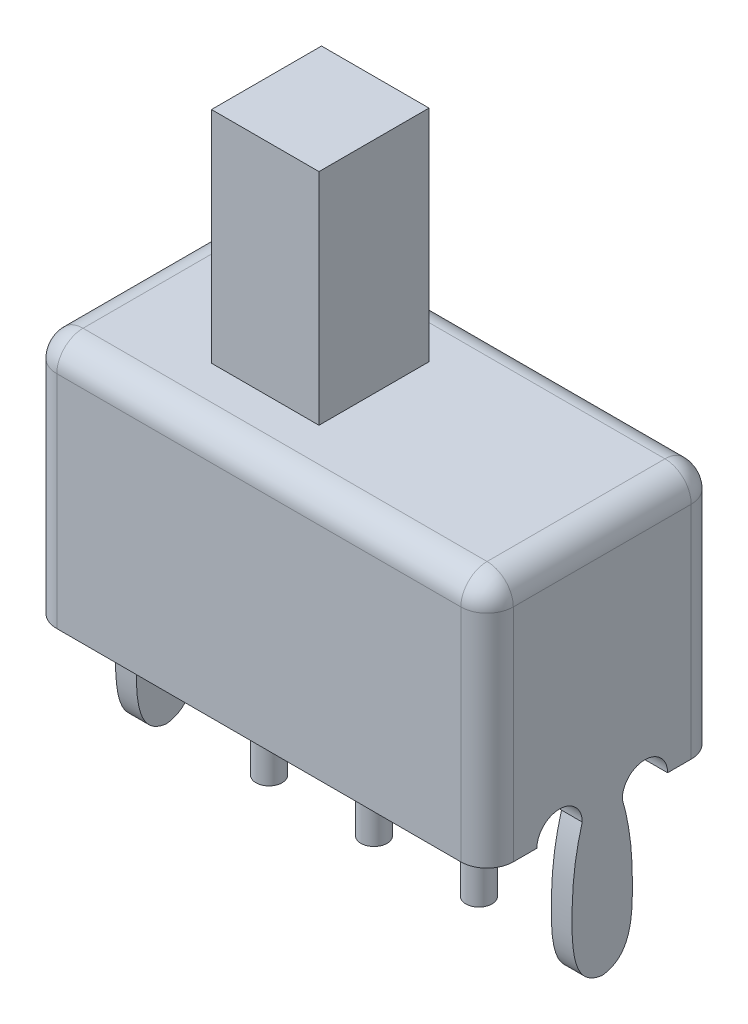
ISO-10303-21;
HEADER;
FILE_DESCRIPTION(('STEP AP214'),'2;1');
FILE_NAME('part.step','',(''),(''),'','','');
FILE_SCHEMA(('AUTOMOTIVE_DESIGN { 1 0 10303 214 1 1 1 1 }'));
ENDSEC;
DATA;
#1=APPLICATION_CONTEXT('core data for automotive mechanical design processes');
#2=APPLICATION_PROTOCOL_DEFINITION('international standard','automotive_design',2000,#1);
#3=PRODUCT_CONTEXT('',#1,'mechanical');
#4=PRODUCT('Part','Part','',(#3));
#5=PRODUCT_RELATED_PRODUCT_CATEGORY('part','',(#4));
#6=PRODUCT_DEFINITION_FORMATION('','',#4);
#7=PRODUCT_DEFINITION_CONTEXT('part definition',#1,'design');
#8=PRODUCT_DEFINITION('design','',#6,#7);
#9=PRODUCT_DEFINITION_SHAPE('','',#8);
#10=(LENGTH_UNIT() NAMED_UNIT(*) SI_UNIT(.MILLI.,.METRE.));
#11=(NAMED_UNIT(*) PLANE_ANGLE_UNIT() SI_UNIT($,.RADIAN.));
#12=(NAMED_UNIT(*) SI_UNIT($,.STERADIAN.) SOLID_ANGLE_UNIT());
#13=UNCERTAINTY_MEASURE_WITH_UNIT(LENGTH_MEASURE(1.E-05),#10,'distance_accuracy_value','');
#14=(GEOMETRIC_REPRESENTATION_CONTEXT(3) GLOBAL_UNCERTAINTY_ASSIGNED_CONTEXT((#13)) GLOBAL_UNIT_ASSIGNED_CONTEXT((#10,
#11,#12)) REPRESENTATION_CONTEXT('',''));
#15=CARTESIAN_POINT('',(0.,0.,0.));
#16=DIRECTION('',(0.,0.,1.));
#17=DIRECTION('',(1.,0.,0.));
#18=AXIS2_PLACEMENT_3D('',#15,#16,#17);
#19=CARTESIAN_POINT('',(4.35,0.,0.381552716050685));
#20=CARTESIAN_POINT('',(4.35,-0.533550096427688,0.533291166974432));
#21=CARTESIAN_POINT('',(4.35,-1.40898428752531,0.619043070075609));
#22=CARTESIAN_POINT('',(4.35,-2.66047603641151,0.532774779958889));
#23=CARTESIAN_POINT('',(4.35,-2.72110857254831,0.));
#24=B_SPLINE_CURVE_WITH_KNOTS('',3,(#19,#20,#21,#22,#23),.UNSPECIFIED.,.F.,.F.,(4,1,4),(0.,
0.537169863718455,1.),.UNSPECIFIED.);
#25=DIRECTION('',(-1.,0.,0.));
#26=VECTOR('',#25,1.);
#27=SURFACE_OF_LINEAR_EXTRUSION('',#24,#26);
#28=CARTESIAN_POINT('',(-3.95490021722665,0.,0.381552716050685));
#29=CARTESIAN_POINT('',(-3.95490021722665,-0.533550096427688,0.533291166974432));
#30=CARTESIAN_POINT('',(-3.95490021722665,-1.40898428752531,0.619043070075609));
#31=CARTESIAN_POINT('',(-3.95490021722665,-2.66047603641151,0.532774779958889));
#32=CARTESIAN_POINT('',(-3.95490021722665,-2.72110857254831,0.));
#33=B_SPLINE_CURVE_WITH_KNOTS('',3,(#28,#29,#30,#31,#32),.UNSPECIFIED.,.F.,.F.,(4,1,4),(0.,
0.537169863718455,1.),.UNSPECIFIED.);
#34=CARTESIAN_POINT('',(-3.95490021722665,0.,0.381552716050685));
#35=VERTEX_POINT('',#34);
#36=CARTESIAN_POINT('',(-3.95490021722665,-2.72110857254831,0.));
#37=VERTEX_POINT('',#36);
#38=EDGE_CURVE('E362',#35,#37,#33,.T.);
#39=ORIENTED_EDGE('',*,*,#38,.F.);
#40=DIRECTION('',(-1.,0.,0.));
#41=VECTOR('',#40,1.);
#42=CARTESIAN_POINT('',(4.35,0.,0.381552716050685));
#43=LINE('',#42,#41);
#44=CARTESIAN_POINT('',(-4.35,0.,0.381552716050685));
#45=VERTEX_POINT('',#44);
#46=EDGE_CURVE('E245',#35,#45,#43,.T.);
#47=ORIENTED_EDGE('',*,*,#46,.T.);
#48=CARTESIAN_POINT('',(-4.35,0.,0.381552716050685));
#49=CARTESIAN_POINT('',(-4.35,-0.533550096427688,0.533291166974432));
#50=CARTESIAN_POINT('',(-4.35,-1.40898428752531,0.619043070075609));
#51=CARTESIAN_POINT('',(-4.35,-2.66047603641151,0.532774779958889));
#52=CARTESIAN_POINT('',(-4.35,-2.72110857254831,0.));
#53=B_SPLINE_CURVE_WITH_KNOTS('',3,(#48,#49,#50,#51,#52),.UNSPECIFIED.,.F.,.F.,(4,1,4),(0.,
0.537169863718455,1.),.UNSPECIFIED.);
#54=CARTESIAN_POINT('',(-4.35,-2.72110857254831,0.));
#55=VERTEX_POINT('',#54);
#56=EDGE_CURVE('E480',#45,#55,#53,.T.);
#57=ORIENTED_EDGE('',*,*,#56,.T.);
#58=DIRECTION('',(-1.,0.,0.));
#59=VECTOR('',#58,1.);
#60=CARTESIAN_POINT('',(4.35,-2.72110857254831,0.));
#61=LINE('',#60,#59);
#62=EDGE_CURVE('E241',#37,#55,#61,.T.);
#63=ORIENTED_EDGE('',*,*,#62,.F.);
#64=EDGE_LOOP('',(#39,#47,#57,#63));
#65=FACE_BOUND('',#64,.T.);
#66=ADVANCED_FACE('F37',(#65),#27,.F.);
#67=CARTESIAN_POINT('',(3.95490021722665,0.,0.381552716050685));
#68=CARTESIAN_POINT('',(3.95490021722665,-0.533550096427688,0.533291166974432));
#69=CARTESIAN_POINT('',(3.95490021722665,-1.40898428752531,0.619043070075609));
#70=CARTESIAN_POINT('',(3.95490021722665,-2.66047603641151,0.532774779958889));
#71=CARTESIAN_POINT('',(3.95490021722665,-2.72110857254831,0.));
#72=B_SPLINE_CURVE_WITH_KNOTS('',3,(#67,#68,#69,#70,#71),.UNSPECIFIED.,.F.,.F.,(4,1,4),(0.,
0.537169863718455,1.),.UNSPECIFIED.);
#73=CARTESIAN_POINT('',(3.95490021722665,-2.72110857254831,0.));
#74=VERTEX_POINT('',#73);
#75=CARTESIAN_POINT('',(3.95490021722665,0.,0.381552716050685));
#76=VERTEX_POINT('',#75);
#77=EDGE_CURVE('E347',#74,#76,#72,.F.);
#78=ORIENTED_EDGE('',*,*,#77,.F.);
#79=CARTESIAN_POINT('',(4.35,-2.72110857254831,0.));
#80=VERTEX_POINT('',#79);
#81=EDGE_CURVE('E242',#80,#74,#61,.T.);
#82=ORIENTED_EDGE('',*,*,#81,.F.);
#83=CARTESIAN_POINT('',(4.35,0.,0.381552716050685));
#84=VERTEX_POINT('',#83);
#85=EDGE_CURVE('E378',#84,#80,#24,.T.);
#86=ORIENTED_EDGE('',*,*,#85,.F.);
#87=EDGE_CURVE('E246',#84,#76,#43,.T.);
#88=ORIENTED_EDGE('',*,*,#87,.T.);
#89=EDGE_LOOP('',(#78,#82,#86,#88));
#90=FACE_BOUND('',#89,.T.);
#91=ADVANCED_FACE('F395',(#90),#27,.F.);
#92=CARTESIAN_POINT('',(4.35,-2.72110857254831,0.));
#93=CARTESIAN_POINT('',(4.35,-2.66047603641151,-0.532774779958891));
#94=CARTESIAN_POINT('',(4.35,-1.40898428752531,-0.619043070075611));
#95=CARTESIAN_POINT('',(4.35,-0.533550096427688,-0.533291166974434));
#96=CARTESIAN_POINT('',(4.35,0.,-0.381552716050687));
#97=B_SPLINE_CURVE_WITH_KNOTS('',3,(#92,#93,#94,#95,#96),.UNSPECIFIED.,.F.,.F.,(4,1,4),(0.,
0.462830136281545,1.),.UNSPECIFIED.);
#98=DIRECTION('',(-1.,0.,0.));
#99=VECTOR('',#98,1.);
#100=SURFACE_OF_LINEAR_EXTRUSION('',#97,#99);
#101=CARTESIAN_POINT('',(-3.95490021722665,-2.72110857254831,0.));
#102=CARTESIAN_POINT('',(-3.95490021722665,-2.66047603641151,-0.532774779958891));
#103=CARTESIAN_POINT('',(-3.95490021722665,-1.40898428752531,-0.619043070075611));
#104=CARTESIAN_POINT('',(-3.95490021722665,-0.533550096427688,-0.533291166974434));
#105=CARTESIAN_POINT('',(-3.95490021722665,0.,-0.381552716050687));
#106=B_SPLINE_CURVE_WITH_KNOTS('',3,(#101,#102,#103,#104,#105),.UNSPECIFIED.,.F.,.F.,(4,1,4),
(0.,0.462830136281545,1.),.UNSPECIFIED.);
#107=CARTESIAN_POINT('',(-3.95490021722665,0.,-0.381552716050685));
#108=VERTEX_POINT('',#107);
#109=EDGE_CURVE('E354',#37,#108,#106,.T.);
#110=ORIENTED_EDGE('',*,*,#109,.F.);
#111=ORIENTED_EDGE('',*,*,#62,.T.);
#112=CARTESIAN_POINT('',(-4.35,-2.72110857254831,0.));
#113=CARTESIAN_POINT('',(-4.35,-2.66047603641151,-0.532774779958891));
#114=CARTESIAN_POINT('',(-4.35,-1.40898428752531,-0.619043070075611));
#115=CARTESIAN_POINT('',(-4.35,-0.533550096427688,-0.533291166974434));
#116=CARTESIAN_POINT('',(-4.35,0.,-0.381552716050687));
#117=B_SPLINE_CURVE_WITH_KNOTS('',3,(#112,#113,#114,#115,#116),.UNSPECIFIED.,.F.,.F.,(4,1,4),
(0.,0.462830136281545,1.),.UNSPECIFIED.);
#118=CARTESIAN_POINT('',(-4.35,0.,-0.381552716050685));
#119=VERTEX_POINT('',#118);
#120=EDGE_CURVE('E475',#55,#119,#117,.T.);
#121=ORIENTED_EDGE('',*,*,#120,.T.);
#122=DIRECTION('',(-1.,0.,0.));
#123=VECTOR('',#122,1.);
#124=CARTESIAN_POINT('',(4.35,0.,-0.381552716050685));
#125=LINE('',#124,#123);
#126=EDGE_CURVE('E237',#108,#119,#125,.T.);
#127=ORIENTED_EDGE('',*,*,#126,.F.);
#128=EDGE_LOOP('',(#110,#111,#121,#127));
#129=FACE_BOUND('',#128,.T.);
#130=ADVANCED_FACE('F397',(#129),#100,.F.);
#131=CARTESIAN_POINT('',(3.95490021722665,-2.72110857254831,0.));
#132=CARTESIAN_POINT('',(3.95490021722665,-2.66047603641151,-0.532774779958891));
#133=CARTESIAN_POINT('',(3.95490021722665,-1.40898428752531,-0.619043070075611));
#134=CARTESIAN_POINT('',(3.95490021722665,-0.533550096427688,-0.533291166974434));
#135=CARTESIAN_POINT('',(3.95490021722665,0.,-0.381552716050687));
#136=B_SPLINE_CURVE_WITH_KNOTS('',3,(#131,#132,#133,#134,#135),.UNSPECIFIED.,.F.,.F.,(4,1,4),
(0.,0.462830136281545,1.),.UNSPECIFIED.);
#137=CARTESIAN_POINT('',(3.95490021722665,0.,-0.381552716050685));
#138=VERTEX_POINT('',#137);
#139=EDGE_CURVE('E343',#138,#74,#136,.F.);
#140=ORIENTED_EDGE('',*,*,#139,.F.);
#141=CARTESIAN_POINT('',(4.35,0.,-0.381552716050685));
#142=VERTEX_POINT('',#141);
#143=EDGE_CURVE('E238',#142,#138,#125,.T.);
#144=ORIENTED_EDGE('',*,*,#143,.F.);
#145=EDGE_CURVE('E383',#80,#142,#97,.T.);
#146=ORIENTED_EDGE('',*,*,#145,.F.);
#147=ORIENTED_EDGE('',*,*,#81,.T.);
#148=EDGE_LOOP('',(#140,#144,#146,#147));
#149=FACE_BOUND('',#148,.T.);
#150=ADVANCED_FACE('F506',(#149),#100,.F.);
#151=CARTESIAN_POINT('',(4.35,4.70753413408899,-1.0484251024618));
#152=DIRECTION('',(0.,0.,1.));
#153=DIRECTION('',(1.,0.,0.));
#154=AXIS2_PLACEMENT_3D('',#151,#152,#153);
#155=PLANE('',#154);
#156=DIRECTION('',(0.,-1.,0.));
#157=VECTOR('',#156,1.);
#158=CARTESIAN_POINT('',(-2.04866945764033,4.70753413408899,-1.0484251024618));
#159=LINE('',#158,#157);
#160=CARTESIAN_POINT('',(-2.04866945764033,8.89467131542077,-1.0484251024618));
#161=VERTEX_POINT('',#160);
#162=CARTESIAN_POINT('',(-2.04866945764033,4.70753413408899,-1.0484251024618));
#163=VERTEX_POINT('',#162);
#164=EDGE_CURVE('E200',#161,#163,#159,.T.);
#165=ORIENTED_EDGE('',*,*,#164,.F.);
#166=DIRECTION('',(-1.,0.,0.));
#167=VECTOR('',#166,1.);
#168=CARTESIAN_POINT('',(4.35,8.89467131542077,-1.0484251024618));
#169=LINE('',#168,#167);
#170=CARTESIAN_POINT('',(0.,8.89467131542077,-1.0484251024618));
#171=VERTEX_POINT('',#170);
#172=EDGE_CURVE('E210',#171,#161,#169,.T.);
#173=ORIENTED_EDGE('',*,*,#172,.F.);
#174=DIRECTION('',(0.,1.,0.));
#175=VECTOR('',#174,1.);
#176=CARTESIAN_POINT('',(0.,4.70753413408899,-1.0484251024618));
#177=LINE('',#176,#175);
#178=CARTESIAN_POINT('',(0.,4.70753413408899,-1.0484251024618));
#179=VERTEX_POINT('',#178);
#180=EDGE_CURVE('E201',#179,#171,#177,.T.);
#181=ORIENTED_EDGE('',*,*,#180,.F.);
#182=DIRECTION('',(-1.,0.,0.));
#183=VECTOR('',#182,1.);
#184=CARTESIAN_POINT('',(4.35,4.70753413408899,-1.0484251024618));
#185=LINE('',#184,#183);
#186=EDGE_CURVE('E218',#179,#163,#185,.T.);
#187=ORIENTED_EDGE('',*,*,#186,.T.);
#188=EDGE_LOOP('',(#165,#173,#181,#187));
#189=FACE_BOUND('',#188,.T.);
#190=ADVANCED_FACE('F597',(#189),#155,.F.);
#191=CARTESIAN_POINT('',(4.35,8.89467131542077,1.0484251024618));
#192=DIRECTION('',(0.,-1.,0.));
#193=DIRECTION('',(0.,0.,-1.));
#194=AXIS2_PLACEMENT_3D('',#191,#192,#193);
#195=PLANE('',#194);
#196=DIRECTION('',(0.,0.,-1.));
#197=VECTOR('',#196,1.);
#198=CARTESIAN_POINT('',(-2.04866945764033,8.89467131542077,2.19506792805727));
#199=LINE('',#198,#197);
#200=CARTESIAN_POINT('',(-2.04866945764033,8.89467131542077,1.0484251024618));
#201=VERTEX_POINT('',#200);
#202=EDGE_CURVE('E193',#201,#161,#199,.T.);
#203=ORIENTED_EDGE('',*,*,#202,.F.);
#204=DIRECTION('',(-1.,0.,0.));
#205=VECTOR('',#204,1.);
#206=CARTESIAN_POINT('',(4.35,8.89467131542077,1.0484251024618));
#207=LINE('',#206,#205);
#208=CARTESIAN_POINT('',(0.,8.89467131542077,1.0484251024618));
#209=VERTEX_POINT('',#208);
#210=EDGE_CURVE('E208',#209,#201,#207,.T.);
#211=ORIENTED_EDGE('',*,*,#210,.F.);
#212=DIRECTION('',(0.,0.,-1.));
#213=VECTOR('',#212,1.);
#214=CARTESIAN_POINT('',(0.,8.89467131542077,2.19506792805727));
#215=LINE('',#214,#213);
#216=EDGE_CURVE('E211',#209,#171,#215,.T.);
#217=ORIENTED_EDGE('',*,*,#216,.T.);
#218=ORIENTED_EDGE('',*,*,#172,.T.);
#219=EDGE_LOOP('',(#203,#211,#217,#218));
#220=FACE_BOUND('',#219,.T.);
#221=ADVANCED_FACE('F206',(#220),#195,.F.);
#222=CARTESIAN_POINT('',(4.35,4.70753413408899,1.0484251024618));
#223=DIRECTION('',(0.,0.,-1.));
#224=DIRECTION('',(-1.,0.,0.));
#225=AXIS2_PLACEMENT_3D('',#222,#223,#224);
#226=PLANE('',#225);
#227=DIRECTION('',(0.,1.,0.));
#228=VECTOR('',#227,1.);
#229=CARTESIAN_POINT('',(-2.04866945764033,4.70753413408899,1.0484251024618));
#230=LINE('',#229,#228);
#231=CARTESIAN_POINT('',(-2.04866945764033,4.70753413408899,1.0484251024618));
#232=VERTEX_POINT('',#231);
#233=EDGE_CURVE('E189',#232,#201,#230,.T.);
#234=ORIENTED_EDGE('',*,*,#233,.F.);
#235=DIRECTION('',(-1.,0.,0.));
#236=VECTOR('',#235,1.);
#237=CARTESIAN_POINT('',(4.35,4.70753413408899,1.0484251024618));
#238=LINE('',#237,#236);
#239=CARTESIAN_POINT('',(0.,4.70753413408899,1.0484251024618));
#240=VERTEX_POINT('',#239);
#241=EDGE_CURVE('E216',#240,#232,#238,.T.);
#242=ORIENTED_EDGE('',*,*,#241,.F.);
#243=DIRECTION('',(0.,-1.,0.));
#244=VECTOR('',#243,1.);
#245=CARTESIAN_POINT('',(0.,4.70753413408899,1.0484251024618));
#246=LINE('',#245,#244);
#247=EDGE_CURVE('E215',#209,#240,#246,.T.);
#248=ORIENTED_EDGE('',*,*,#247,.F.);
#249=ORIENTED_EDGE('',*,*,#210,.T.);
#250=EDGE_LOOP('',(#234,#242,#248,#249));
#251=FACE_BOUND('',#250,.T.);
#252=ADVANCED_FACE('F214',(#251),#226,.F.);
#253=CARTESIAN_POINT('',(4.35,0.,0.813528527080854));
#254=DIRECTION('',(-1.,0.,0.));
#255=DIRECTION('',(0.,0.,1.));
#256=AXIS2_PLACEMENT_3D('',#253,#254,#255);
#257=PLANE('',#256);
#258=DIRECTION('',(0.,0.,-1.));
#259=VECTOR('',#258,1.);
#260=CARTESIAN_POINT('',(4.35,0.,-2.19506792805727));
#261=LINE('',#260,#259);
#262=CARTESIAN_POINT('',(4.35,0.,-1.24550433811102));
#263=VERTEX_POINT('',#262);
#264=CARTESIAN_POINT('',(4.35,0.,-1.69506792805727));
#265=VERTEX_POINT('',#264);
#266=EDGE_CURVE('E469',#263,#265,#261,.T.);
#267=ORIENTED_EDGE('',*,*,#266,.T.);
#268=DIRECTION('',(0.,1.,0.));
#269=VECTOR('',#268,1.);
#270=CARTESIAN_POINT('',(4.35,0.,-1.69506792805727));
#271=LINE('',#270,#269);
#272=CARTESIAN_POINT('',(4.35,4.20753413408899,-1.69506792805727));
#273=VERTEX_POINT('',#272);
#274=EDGE_CURVE('E286',#265,#273,#271,.T.);
#275=ORIENTED_EDGE('',*,*,#274,.T.);
#276=DIRECTION('',(0.,0.,1.));
#277=VECTOR('',#276,1.);
#278=CARTESIAN_POINT('',(4.35,4.20753413408899,0.813528527080854));
#279=LINE('',#278,#277);
#280=CARTESIAN_POINT('',(4.35,4.20753413408899,1.69506792805727));
#281=VERTEX_POINT('',#280);
#282=EDGE_CURVE('E54',#273,#281,#279,.T.);
#283=ORIENTED_EDGE('',*,*,#282,.T.);
#284=DIRECTION('',(0.,-1.,0.));
#285=VECTOR('',#284,1.);
#286=CARTESIAN_POINT('',(4.35,0.,1.69506792805727));
#287=LINE('',#286,#285);
#288=CARTESIAN_POINT('',(4.35,0.,1.69506792805727));
#289=VERTEX_POINT('',#288);
#290=EDGE_CURVE('E284',#281,#289,#287,.T.);
#291=ORIENTED_EDGE('',*,*,#290,.T.);
#292=DIRECTION('',(0.,0.,-1.));
#293=VECTOR('',#292,1.);
#294=CARTESIAN_POINT('',(4.35,0.,2.19506792805727));
#295=LINE('',#294,#293);
#296=CARTESIAN_POINT('',(4.35,0.,1.24550433811102));
#297=VERTEX_POINT('',#296);
#298=EDGE_CURVE('E370',#289,#297,#295,.T.);
#299=ORIENTED_EDGE('',*,*,#298,.T.);
#300=CARTESIAN_POINT('',(4.35,0.,0.813528527080854));
#301=DIRECTION('',(-1.,0.,0.));
#302=DIRECTION('',(0.,0.,1.));
#303=AXIS2_PLACEMENT_3D('',#300,#301,#302);
#304=CIRCLE('',#303,0.431975811030169);
#305=EDGE_CURVE('E375',#297,#84,#304,.T.);
#306=ORIENTED_EDGE('',*,*,#305,.T.);
#307=ORIENTED_EDGE('',*,*,#85,.T.);
#308=ORIENTED_EDGE('',*,*,#145,.T.);
#309=CARTESIAN_POINT('',(4.35,0.,-0.813528527080854));
#310=DIRECTION('',(-1.,0.,0.));
#311=DIRECTION('',(0.,0.,-1.));
#312=AXIS2_PLACEMENT_3D('',#309,#310,#311);
#313=CIRCLE('',#312,0.431975811030169);
#314=EDGE_CURVE('E496',#142,#263,#313,.T.);
#315=ORIENTED_EDGE('',*,*,#314,.T.);
#316=EDGE_LOOP('',(#267,#275,#283,#291,#299,#306,#307,#308,#315));
#317=FACE_BOUND('',#316,.T.);
#318=ADVANCED_FACE('F501',(#317),#257,.F.);
#319=CARTESIAN_POINT('',(-4.35,0.,0.813528527080854));
#320=DIRECTION('',(-1.,0.,0.));
#321=DIRECTION('',(0.,0.,1.));
#322=AXIS2_PLACEMENT_3D('',#319,#320,#321);
#323=PLANE('',#322);
#324=DIRECTION('',(0.,0.,1.));
#325=VECTOR('',#324,1.);
#326=CARTESIAN_POINT('',(-4.35,4.20753413408899,-1.69506792805727));
#327=LINE('',#326,#325);
#328=CARTESIAN_POINT('',(-4.35,4.20753413408899,1.69506792805727));
#329=VERTEX_POINT('',#328);
#330=CARTESIAN_POINT('',(-4.35,4.20753413408899,-1.69506792805727));
#331=VERTEX_POINT('',#330);
#332=EDGE_CURVE('E257',#329,#331,#327,.F.);
#333=ORIENTED_EDGE('',*,*,#332,.T.);
#334=DIRECTION('',(0.,1.,0.));
#335=VECTOR('',#334,1.);
#336=CARTESIAN_POINT('',(-4.35,0.,-1.69506792805727));
#337=LINE('',#336,#335);
#338=CARTESIAN_POINT('',(-4.35,0.,-1.69506792805727));
#339=VERTEX_POINT('',#338);
#340=EDGE_CURVE('E261',#331,#339,#337,.F.);
#341=ORIENTED_EDGE('',*,*,#340,.T.);
#342=DIRECTION('',(0.,0.,-1.));
#343=VECTOR('',#342,1.);
#344=CARTESIAN_POINT('',(-4.35,0.,-2.19506792805727));
#345=LINE('',#344,#343);
#346=CARTESIAN_POINT('',(-4.35,0.,-1.24550433811102));
#347=VERTEX_POINT('',#346);
#348=EDGE_CURVE('E376',#347,#339,#345,.T.);
#349=ORIENTED_EDGE('',*,*,#348,.F.);
#350=CARTESIAN_POINT('',(-4.35,0.,-0.813528527080854));
#351=DIRECTION('',(-1.,0.,0.));
#352=DIRECTION('',(0.,0.,-1.));
#353=AXIS2_PLACEMENT_3D('',#350,#351,#352);
#354=CIRCLE('',#353,0.431975811030169);
#355=EDGE_CURVE('E472',#119,#347,#354,.T.);
#356=ORIENTED_EDGE('',*,*,#355,.F.);
#357=ORIENTED_EDGE('',*,*,#120,.F.);
#358=ORIENTED_EDGE('',*,*,#56,.F.);
#359=CARTESIAN_POINT('',(-4.35,0.,0.813528527080854));
#360=DIRECTION('',(-1.,0.,0.));
#361=DIRECTION('',(0.,0.,1.));
#362=AXIS2_PLACEMENT_3D('',#359,#360,#361);
#363=CIRCLE('',#362,0.431975811030169);
#364=CARTESIAN_POINT('',(-4.35,0.,1.24550433811102));
#365=VERTEX_POINT('',#364);
#366=EDGE_CURVE('E488',#365,#45,#363,.T.);
#367=ORIENTED_EDGE('',*,*,#366,.F.);
#368=DIRECTION('',(0.,0.,-1.));
#369=VECTOR('',#368,1.);
#370=CARTESIAN_POINT('',(-4.35,0.,2.19506792805727));
#371=LINE('',#370,#369);
#372=CARTESIAN_POINT('',(-4.35,0.,1.69506792805727));
#373=VERTEX_POINT('',#372);
#374=EDGE_CURVE('E369',#373,#365,#371,.T.);
#375=ORIENTED_EDGE('',*,*,#374,.F.);
#376=DIRECTION('',(0.,-1.,0.));
#377=VECTOR('',#376,1.);
#378=CARTESIAN_POINT('',(-4.35,4.20753413408898,1.69506792805727));
#379=LINE('',#378,#377);
#380=EDGE_CURVE('E259',#373,#329,#379,.F.);
#381=ORIENTED_EDGE('',*,*,#380,.T.);
#382=EDGE_LOOP('',(#333,#341,#349,#356,#357,#358,#367,#375,#381));
#383=FACE_BOUND('',#382,.T.);
#384=ADVANCED_FACE('F407',(#383),#323,.T.);
#385=CARTESIAN_POINT('',(4.35,0.,2.19506792805727));
#386=DIRECTION('',(0.,1.,0.));
#387=DIRECTION('',(0.,0.,1.));
#388=AXIS2_PLACEMENT_3D('',#385,#386,#387);
#389=PLANE('',#388);
#390=DIRECTION('',(-1.,0.,0.));
#391=VECTOR('',#390,1.);
#392=CARTESIAN_POINT('',(4.35,0.,2.19506792805727));
#393=LINE('',#392,#391);
#394=CARTESIAN_POINT('',(3.85,0.,2.19506792805727));
#395=VERTEX_POINT('',#394);
#396=CARTESIAN_POINT('',(-3.85,0.,2.19506792805727));
#397=VERTEX_POINT('',#396);
#398=EDGE_CURVE('E464',#395,#397,#393,.T.);
#399=ORIENTED_EDGE('',*,*,#398,.T.);
#400=CARTESIAN_POINT('',(-3.85,0.,1.69506792805727));
#401=DIRECTION('',(0.,1.,0.));
#402=DIRECTION('',(0.,0.,1.));
#403=AXIS2_PLACEMENT_3D('',#400,#401,#402);
#404=CIRCLE('',#403,0.5);
#405=EDGE_CURVE('E277',#397,#373,#404,.F.);
#406=ORIENTED_EDGE('',*,*,#405,.T.);
#407=ORIENTED_EDGE('',*,*,#374,.T.);
#408=DIRECTION('',(-1.,0.,0.));
#409=VECTOR('',#408,1.);
#410=CARTESIAN_POINT('',(4.35,0.,1.24550433811102));
#411=LINE('',#410,#409);
#412=EDGE_CURVE('E249',#297,#365,#411,.T.);
#413=ORIENTED_EDGE('',*,*,#412,.F.);
#414=ORIENTED_EDGE('',*,*,#298,.F.);
#415=CARTESIAN_POINT('',(3.85,0.,1.69506792805727));
#416=DIRECTION('',(0.,1.,0.));
#417=DIRECTION('',(0.,0.,1.));
#418=AXIS2_PLACEMENT_3D('',#415,#416,#417);
#419=CIRCLE('',#418,0.5);
#420=EDGE_CURVE('E275',#289,#395,#419,.F.);
#421=ORIENTED_EDGE('',*,*,#420,.T.);
#422=EDGE_LOOP('',(#399,#406,#407,#413,#414,#421));
#423=FACE_BOUND('',#422,.T.);
#424=ADVANCED_FACE('F403',(#423),#389,.F.);
#425=CARTESIAN_POINT('',(4.35,0.,0.813528527080854));
#426=DIRECTION('',(-1.,0.,0.));
#427=DIRECTION('',(0.,0.,1.));
#428=AXIS2_PLACEMENT_3D('',#425,#426,#427);
#429=CYLINDRICAL_SURFACE('',#428,0.431975811030169);
#430=ORIENTED_EDGE('',*,*,#366,.T.);
#431=ORIENTED_EDGE('',*,*,#46,.F.);
#432=DIRECTION('',(-1.,0.,0.));
#433=VECTOR('',#432,1.);
#434=CARTESIAN_POINT('',(4.35,0.,0.381552716050685));
#435=LINE('',#434,#433);
#436=EDGE_CURVE('E338',#76,#35,#435,.T.);
#437=ORIENTED_EDGE('',*,*,#436,.F.);
#438=ORIENTED_EDGE('',*,*,#87,.F.);
#439=ORIENTED_EDGE('',*,*,#305,.F.);
#440=ORIENTED_EDGE('',*,*,#412,.T.);
#441=EDGE_LOOP('',(#430,#431,#437,#438,#439,#440));
#442=FACE_BOUND('',#441,.T.);
#443=ADVANCED_FACE('F399',(#442),#429,.F.);
#444=CARTESIAN_POINT('',(4.35,0.,-0.813528527080854));
#445=DIRECTION('',(-1.,0.,0.));
#446=DIRECTION('',(0.,0.,1.));
#447=AXIS2_PLACEMENT_3D('',#444,#445,#446);
#448=CYLINDRICAL_SURFACE('',#447,0.431975811030169);
#449=ORIENTED_EDGE('',*,*,#355,.T.);
#450=DIRECTION('',(-1.,0.,0.));
#451=VECTOR('',#450,1.);
#452=CARTESIAN_POINT('',(4.35,0.,-1.24550433811102));
#453=LINE('',#452,#451);
#454=EDGE_CURVE('E235',#263,#347,#453,.T.);
#455=ORIENTED_EDGE('',*,*,#454,.F.);
#456=ORIENTED_EDGE('',*,*,#314,.F.);
#457=ORIENTED_EDGE('',*,*,#143,.T.);
#458=DIRECTION('',(-1.,0.,0.));
#459=VECTOR('',#458,1.);
#460=CARTESIAN_POINT('',(4.35,0.,-0.381552716050685));
#461=LINE('',#460,#459);
#462=EDGE_CURVE('E332',#108,#138,#461,.F.);
#463=ORIENTED_EDGE('',*,*,#462,.F.);
#464=ORIENTED_EDGE('',*,*,#126,.T.);
#465=EDGE_LOOP('',(#449,#455,#456,#457,#463,#464));
#466=FACE_BOUND('',#465,.T.);
#467=ADVANCED_FACE('F402',(#466),#448,.F.);
#468=CARTESIAN_POINT('',(4.35,0.,-2.19506792805727));
#469=DIRECTION('',(0.,1.,0.));
#470=DIRECTION('',(0.,0.,1.));
#471=AXIS2_PLACEMENT_3D('',#468,#469,#470);
#472=PLANE('',#471);
#473=ORIENTED_EDGE('',*,*,#348,.T.);
#474=CARTESIAN_POINT('',(-3.85,0.,-1.69506792805727));
#475=DIRECTION('',(0.,1.,0.));
#476=DIRECTION('',(0.,0.,1.));
#477=AXIS2_PLACEMENT_3D('',#474,#475,#476);
#478=CIRCLE('',#477,0.5);
#479=CARTESIAN_POINT('',(-3.85,0.,-2.19506792805727));
#480=VERTEX_POINT('',#479);
#481=EDGE_CURVE('E265',#339,#480,#478,.F.);
#482=ORIENTED_EDGE('',*,*,#481,.T.);
#483=DIRECTION('',(-1.,0.,0.));
#484=VECTOR('',#483,1.);
#485=CARTESIAN_POINT('',(4.35,0.,-2.19506792805727));
#486=LINE('',#485,#484);
#487=CARTESIAN_POINT('',(3.85,0.,-2.19506792805727));
#488=VERTEX_POINT('',#487);
#489=EDGE_CURVE('E232',#488,#480,#486,.T.);
#490=ORIENTED_EDGE('',*,*,#489,.F.);
#491=CARTESIAN_POINT('',(3.85,0.,-1.69506792805727));
#492=DIRECTION('',(0.,1.,0.));
#493=DIRECTION('',(0.,0.,1.));
#494=AXIS2_PLACEMENT_3D('',#491,#492,#493);
#495=CIRCLE('',#494,0.5);
#496=EDGE_CURVE('E263',#488,#265,#495,.F.);
#497=ORIENTED_EDGE('',*,*,#496,.T.);
#498=ORIENTED_EDGE('',*,*,#266,.F.);
#499=ORIENTED_EDGE('',*,*,#454,.T.);
#500=EDGE_LOOP('',(#473,#482,#490,#497,#498,#499));
#501=FACE_BOUND('',#500,.T.);
#502=ADVANCED_FACE('F513',(#501),#472,.F.);
#503=CARTESIAN_POINT('',(4.35,0.,-2.19506792805727));
#504=DIRECTION('',(0.,0.,1.));
#505=DIRECTION('',(1.,0.,0.));
#506=AXIS2_PLACEMENT_3D('',#503,#504,#505);
#507=PLANE('',#506);
#508=ORIENTED_EDGE('',*,*,#489,.T.);
#509=DIRECTION('',(0.,1.,0.));
#510=VECTOR('',#509,1.);
#511=CARTESIAN_POINT('',(-3.85,4.20753413408898,-2.19506792805727));
#512=LINE('',#511,#510);
#513=CARTESIAN_POINT('',(-3.85,4.20753413408898,-2.19506792805727));
#514=VERTEX_POINT('',#513);
#515=EDGE_CURVE('E254',#480,#514,#512,.T.);
#516=ORIENTED_EDGE('',*,*,#515,.T.);
#517=DIRECTION('',(-1.,0.,0.));
#518=VECTOR('',#517,1.);
#519=CARTESIAN_POINT('',(4.35,4.20753413408898,-2.19506792805727));
#520=LINE('',#519,#518);
#521=CARTESIAN_POINT('',(3.85,4.20753413408898,-2.19506792805727));
#522=VERTEX_POINT('',#521);
#523=EDGE_CURVE('E229',#522,#514,#520,.T.);
#524=ORIENTED_EDGE('',*,*,#523,.F.);
#525=DIRECTION('',(0.,1.,0.));
#526=VECTOR('',#525,1.);
#527=CARTESIAN_POINT('',(3.85,0.,-2.19506792805727));
#528=LINE('',#527,#526);
#529=EDGE_CURVE('E252',#522,#488,#528,.F.);
#530=ORIENTED_EDGE('',*,*,#529,.T.);
#531=EDGE_LOOP('',(#508,#516,#524,#530));
#532=FACE_BOUND('',#531,.T.);
#533=ADVANCED_FACE('F522',(#532),#507,.F.);
#534=CARTESIAN_POINT('',(4.35,4.20753413408899,-1.69506792805727));
#535=DIRECTION('',(-1.,0.,0.));
#536=DIRECTION('',(0.,0.,1.));
#537=AXIS2_PLACEMENT_3D('',#534,#535,#536);
#538=CYLINDRICAL_SURFACE('',#537,0.499999999999999);
#539=ORIENTED_EDGE('',*,*,#523,.T.);
#540=CARTESIAN_POINT('',(-3.85,4.20753413408899,-1.69506792805727));
#541=DIRECTION('',(-1.,0.,0.));
#542=DIRECTION('',(0.,0.,1.));
#543=AXIS2_PLACEMENT_3D('',#540,#541,#542);
#544=CIRCLE('',#543,0.499999999999999);
#545=CARTESIAN_POINT('',(-3.85,4.70753413408899,-1.69506792805727));
#546=VERTEX_POINT('',#545);
#547=EDGE_CURVE('E269',#514,#546,#544,.F.);
#548=ORIENTED_EDGE('',*,*,#547,.T.);
#549=DIRECTION('',(-1.,0.,0.));
#550=VECTOR('',#549,1.);
#551=CARTESIAN_POINT('',(4.35,4.70753413408899,-1.69506792805727));
#552=LINE('',#551,#550);
#553=CARTESIAN_POINT('',(3.85,4.70753413408899,-1.69506792805727));
#554=VERTEX_POINT('',#553);
#555=EDGE_CURVE('E226',#554,#546,#552,.T.);
#556=ORIENTED_EDGE('',*,*,#555,.F.);
#557=CARTESIAN_POINT('',(3.85,4.20753413408899,-1.69506792805727));
#558=DIRECTION('',(-1.,0.,0.));
#559=DIRECTION('',(0.,0.,1.));
#560=AXIS2_PLACEMENT_3D('',#557,#558,#559);
#561=CIRCLE('',#560,0.499999999999999);
#562=EDGE_CURVE('E267',#554,#522,#561,.T.);
#563=ORIENTED_EDGE('',*,*,#562,.T.);
#564=EDGE_LOOP('',(#539,#548,#556,#563));
#565=FACE_BOUND('',#564,.T.);
#566=ADVANCED_FACE('F521',(#565),#538,.T.);
#567=CARTESIAN_POINT('',(4.35,4.70753413408899,1.69506792805727));
#568=DIRECTION('',(0.,-1.,0.));
#569=DIRECTION('',(0.,0.,-1.));
#570=AXIS2_PLACEMENT_3D('',#567,#568,#569);
#571=PLANE('',#570);
#572=DIRECTION('',(0.,0.,-1.));
#573=VECTOR('',#572,1.);
#574=CARTESIAN_POINT('',(-2.04866945764033,4.70753413408899,2.19506792805727));
#575=LINE('',#574,#573);
#576=EDGE_CURVE('E195',#232,#163,#575,.T.);
#577=ORIENTED_EDGE('',*,*,#576,.T.);
#578=ORIENTED_EDGE('',*,*,#186,.F.);
#579=DIRECTION('',(0.,0.,-1.));
#580=VECTOR('',#579,1.);
#581=CARTESIAN_POINT('',(0.,4.70753413408899,2.19506792805727));
#582=LINE('',#581,#580);
#583=EDGE_CURVE('E301',#240,#179,#582,.T.);
#584=ORIENTED_EDGE('',*,*,#583,.F.);
#585=ORIENTED_EDGE('',*,*,#241,.T.);
#586=EDGE_LOOP('',(#577,#578,#584,#585));
#587=FACE_BOUND('',#586,.T.);
#588=ORIENTED_EDGE('',*,*,#555,.T.);
#589=DIRECTION('',(0.,0.,1.));
#590=VECTOR('',#589,1.);
#591=CARTESIAN_POINT('',(-3.85,4.70753413408899,1.69506792805727));
#592=LINE('',#591,#590);
#593=CARTESIAN_POINT('',(-3.85,4.70753413408899,1.69506792805727));
#594=VERTEX_POINT('',#593);
#595=EDGE_CURVE('E11',#546,#594,#592,.T.);
#596=ORIENTED_EDGE('',*,*,#595,.T.);
#597=DIRECTION('',(-1.,0.,0.));
#598=VECTOR('',#597,1.);
#599=CARTESIAN_POINT('',(4.35,4.70753413408899,1.69506792805727));
#600=LINE('',#599,#598);
#601=CARTESIAN_POINT('',(3.85,4.70753413408899,1.69506792805727));
#602=VERTEX_POINT('',#601);
#603=EDGE_CURVE('E220',#602,#594,#600,.T.);
#604=ORIENTED_EDGE('',*,*,#603,.F.);
#605=DIRECTION('',(0.,0.,1.));
#606=VECTOR('',#605,1.);
#607=CARTESIAN_POINT('',(3.85,4.70753413408899,1.69506792805727));
#608=LINE('',#607,#606);
#609=EDGE_CURVE('E46',#602,#554,#608,.F.);
#610=ORIENTED_EDGE('',*,*,#609,.T.);
#611=EDGE_LOOP('',(#588,#596,#604,#610));
#612=FACE_BOUND('',#611,.T.);
#613=ADVANCED_FACE('F461',(#587,#612),#571,.F.);
#614=CARTESIAN_POINT('',(4.35,4.20753413408899,1.69506792805727));
#615=DIRECTION('',(-1.,0.,0.));
#616=DIRECTION('',(0.,0.,1.));
#617=AXIS2_PLACEMENT_3D('',#614,#615,#616);
#618=CYLINDRICAL_SURFACE('',#617,0.5);
#619=ORIENTED_EDGE('',*,*,#603,.T.);
#620=CARTESIAN_POINT('',(-3.85,4.20753413408899,1.69506792805727));
#621=DIRECTION('',(-1.,0.,0.));
#622=DIRECTION('',(0.,0.,1.));
#623=AXIS2_PLACEMENT_3D('',#620,#621,#622);
#624=CIRCLE('',#623,0.5);
#625=CARTESIAN_POINT('',(-3.85,4.20753413408898,2.19506792805727));
#626=VERTEX_POINT('',#625);
#627=EDGE_CURVE('E281',#594,#626,#624,.F.);
#628=ORIENTED_EDGE('',*,*,#627,.T.);
#629=DIRECTION('',(-1.,0.,0.));
#630=VECTOR('',#629,1.);
#631=CARTESIAN_POINT('',(4.35,4.20753413408898,2.19506792805727));
#632=LINE('',#631,#630);
#633=CARTESIAN_POINT('',(3.85,4.20753413408898,2.19506792805727));
#634=VERTEX_POINT('',#633);
#635=EDGE_CURVE('E459',#634,#626,#632,.T.);
#636=ORIENTED_EDGE('',*,*,#635,.F.);
#637=CARTESIAN_POINT('',(3.85,4.20753413408899,1.69506792805727));
#638=DIRECTION('',(-1.,0.,0.));
#639=DIRECTION('',(0.,0.,1.));
#640=AXIS2_PLACEMENT_3D('',#637,#638,#639);
#641=CIRCLE('',#640,0.5);
#642=EDGE_CURVE('E279',#634,#602,#641,.T.);
#643=ORIENTED_EDGE('',*,*,#642,.T.);
#644=EDGE_LOOP('',(#619,#628,#636,#643));
#645=FACE_BOUND('',#644,.T.);
#646=ADVANCED_FACE('F456',(#645),#618,.T.);
#647=CARTESIAN_POINT('',(4.35,0.,2.19506792805727));
#648=DIRECTION('',(0.,0.,-1.));
#649=DIRECTION('',(-1.,0.,0.));
#650=AXIS2_PLACEMENT_3D('',#647,#648,#649);
#651=PLANE('',#650);
#652=ORIENTED_EDGE('',*,*,#635,.T.);
#653=DIRECTION('',(0.,-1.,0.));
#654=VECTOR('',#653,1.);
#655=CARTESIAN_POINT('',(-3.85,0.,2.19506792805727));
#656=LINE('',#655,#654);
#657=EDGE_CURVE('E273',#626,#397,#656,.T.);
#658=ORIENTED_EDGE('',*,*,#657,.T.);
#659=ORIENTED_EDGE('',*,*,#398,.F.);
#660=DIRECTION('',(0.,-1.,0.));
#661=VECTOR('',#660,1.);
#662=CARTESIAN_POINT('',(3.85,0.,2.19506792805727));
#663=LINE('',#662,#661);
#664=EDGE_CURVE('E271',#395,#634,#663,.F.);
#665=ORIENTED_EDGE('',*,*,#664,.T.);
#666=EDGE_LOOP('',(#652,#658,#659,#665));
#667=FACE_BOUND('',#666,.T.);
#668=ADVANCED_FACE('F534',(#667),#651,.F.);
#669=CARTESIAN_POINT('',(-2.04866945764033,0.,2.19506792805727));
#670=DIRECTION('',(-1.,0.,0.));
#671=DIRECTION('',(0.,0.,1.));
#672=AXIS2_PLACEMENT_3D('',#669,#670,#671);
#673=PLANE('',#672);
#674=ORIENTED_EDGE('',*,*,#164,.T.);
#675=ORIENTED_EDGE('',*,*,#576,.F.);
#676=ORIENTED_EDGE('',*,*,#233,.T.);
#677=ORIENTED_EDGE('',*,*,#202,.T.);
#678=EDGE_LOOP('',(#674,#675,#676,#677));
#679=FACE_BOUND('',#678,.T.);
#680=ADVANCED_FACE('F192',(#679),#673,.T.);
#681=CARTESIAN_POINT('',(0.,0.,2.19506792805727));
#682=DIRECTION('',(1.,0.,0.));
#683=DIRECTION('',(0.,0.,-1.));
#684=AXIS2_PLACEMENT_3D('',#681,#682,#683);
#685=PLANE('',#684);
#686=ORIENTED_EDGE('',*,*,#180,.T.);
#687=ORIENTED_EDGE('',*,*,#216,.F.);
#688=ORIENTED_EDGE('',*,*,#247,.T.);
#689=ORIENTED_EDGE('',*,*,#583,.T.);
#690=EDGE_LOOP('',(#686,#687,#688,#689));
#691=FACE_BOUND('',#690,.T.);
#692=ADVANCED_FACE('F566',(#691),#685,.T.);
#693=CARTESIAN_POINT('',(-3.95490021722665,0.,2.19506792805727));
#694=DIRECTION('',(1.,0.,0.));
#695=DIRECTION('',(0.,0.,-1.));
#696=AXIS2_PLACEMENT_3D('',#693,#694,#695);
#697=PLANE('',#696);
#698=ORIENTED_EDGE('',*,*,#38,.T.);
#699=ORIENTED_EDGE('',*,*,#109,.T.);
#700=DIRECTION('',(0.,0.,-1.));
#701=VECTOR('',#700,1.);
#702=CARTESIAN_POINT('',(-3.95490021722665,0.,2.19506792805727));
#703=LINE('',#702,#701);
#704=EDGE_CURVE('E331',#35,#108,#703,.T.);
#705=ORIENTED_EDGE('',*,*,#704,.F.);
#706=EDGE_LOOP('',(#698,#699,#705));
#707=FACE_BOUND('',#706,.T.);
#708=ADVANCED_FACE('F564',(#707),#697,.T.);
#709=CARTESIAN_POINT('',(3.95490021722665,0.,2.19506792805727));
#710=DIRECTION('',(-1.,0.,0.));
#711=DIRECTION('',(0.,0.,1.));
#712=AXIS2_PLACEMENT_3D('',#709,#710,#711);
#713=PLANE('',#712);
#714=ORIENTED_EDGE('',*,*,#77,.T.);
#715=DIRECTION('',(0.,0.,-1.));
#716=VECTOR('',#715,1.);
#717=CARTESIAN_POINT('',(3.95490021722665,0.,2.19506792805727));
#718=LINE('',#717,#716);
#719=EDGE_CURVE('E328',#76,#138,#718,.T.);
#720=ORIENTED_EDGE('',*,*,#719,.T.);
#721=ORIENTED_EDGE('',*,*,#139,.T.);
#722=EDGE_LOOP('',(#714,#720,#721));
#723=FACE_BOUND('',#722,.T.);
#724=ADVANCED_FACE('F555',(#723),#713,.T.);
#725=CARTESIAN_POINT('',(4.35,0.,2.19506792805727));
#726=DIRECTION('',(0.,-1.,0.));
#727=DIRECTION('',(0.,0.,-1.));
#728=AXIS2_PLACEMENT_3D('',#725,#726,#727);
#729=PLANE('',#728);
#730=CARTESIAN_POINT('',(2.,0.,0.));
#731=DIRECTION('',(0.,-1.,0.));
#732=DIRECTION('',(0.,0.,-1.));
#733=AXIS2_PLACEMENT_3D('',#730,#731,#732);
#734=CIRCLE('',#733,0.25);
#735=CARTESIAN_POINT('',(2.,0.,-0.25));
#736=VERTEX_POINT('',#735);
#737=EDGE_CURVE('E41',#736,#736,#734,.F.);
#738=ORIENTED_EDGE('',*,*,#737,.T.);
#739=EDGE_LOOP('',(#738));
#740=FACE_BOUND('',#739,.T.);
#741=CARTESIAN_POINT('',(-2.,0.,0.));
#742=DIRECTION('',(0.,-1.,0.));
#743=DIRECTION('',(0.,0.,-1.));
#744=AXIS2_PLACEMENT_3D('',#741,#742,#743);
#745=CIRCLE('',#744,0.25);
#746=CARTESIAN_POINT('',(-2.,0.,-0.25));
#747=VERTEX_POINT('',#746);
#748=EDGE_CURVE('E313',#747,#747,#745,.F.);
#749=ORIENTED_EDGE('',*,*,#748,.T.);
#750=EDGE_LOOP('',(#749));
#751=FACE_BOUND('',#750,.T.);
#752=CARTESIAN_POINT('',(0.,0.,0.));
#753=DIRECTION('',(0.,-1.,0.));
#754=DIRECTION('',(0.,0.,-1.));
#755=AXIS2_PLACEMENT_3D('',#752,#753,#754);
#756=CIRCLE('',#755,0.25);
#757=CARTESIAN_POINT('',(0.,0.,-0.25));
#758=VERTEX_POINT('',#757);
#759=EDGE_CURVE('E304',#758,#758,#756,.F.);
#760=ORIENTED_EDGE('',*,*,#759,.T.);
#761=EDGE_LOOP('',(#760));
#762=FACE_BOUND('',#761,.T.);
#763=ORIENTED_EDGE('',*,*,#436,.T.);
#764=ORIENTED_EDGE('',*,*,#704,.T.);
#765=ORIENTED_EDGE('',*,*,#462,.T.);
#766=ORIENTED_EDGE('',*,*,#719,.F.);
#767=EDGE_LOOP('',(#763,#764,#765,#766));
#768=FACE_BOUND('',#767,.T.);
#769=ADVANCED_FACE('F428',(#740,#751,#762,#768),#729,.T.);
#770=CARTESIAN_POINT('',(-3.85,0.,1.69506792805727));
#771=DIRECTION('',(0.,1.,0.));
#772=DIRECTION('',(0.,0.,1.));
#773=AXIS2_PLACEMENT_3D('',#770,#771,#772);
#774=CYLINDRICAL_SURFACE('',#773,0.5);
#775=ORIENTED_EDGE('',*,*,#405,.F.);
#776=ORIENTED_EDGE('',*,*,#657,.F.);
#777=CARTESIAN_POINT('',(-3.85,4.20753413408898,1.69506792805727));
#778=DIRECTION('',(0.,1.,0.));
#779=DIRECTION('',(0.,0.,1.));
#780=AXIS2_PLACEMENT_3D('',#777,#778,#779);
#781=CIRCLE('',#780,0.5);
#782=EDGE_CURVE('E298',#329,#626,#781,.T.);
#783=ORIENTED_EDGE('',*,*,#782,.F.);
#784=ORIENTED_EDGE('',*,*,#380,.F.);
#785=EDGE_LOOP('',(#775,#776,#783,#784));
#786=FACE_BOUND('',#785,.T.);
#787=ADVANCED_FACE('F424',(#786),#774,.T.);
#788=CARTESIAN_POINT('',(-3.85,4.20753413408899,1.69506792805727));
#789=DIRECTION('',(-1.,0.,0.));
#790=DIRECTION('',(0.,0.,1.));
#791=AXIS2_PLACEMENT_3D('',#788,#789,#790);
#792=SPHERICAL_SURFACE('',#791,0.5);
#793=ORIENTED_EDGE('',*,*,#782,.T.);
#794=ORIENTED_EDGE('',*,*,#627,.F.);
#795=CARTESIAN_POINT('',(-3.85,4.20753413408899,1.69506792805727));
#796=DIRECTION('',(0.,0.,-1.));
#797=DIRECTION('',(0.,1.,0.));
#798=AXIS2_PLACEMENT_3D('',#795,#796,#797);
#799=CIRCLE('',#798,0.5);
#800=EDGE_CURVE('E295',#329,#594,#799,.T.);
#801=ORIENTED_EDGE('',*,*,#800,.F.);
#802=EDGE_LOOP('',(#793,#794,#801));
#803=FACE_BOUND('',#802,.T.);
#804=ADVANCED_FACE('F420',(#803),#792,.T.);
#805=CARTESIAN_POINT('',(-3.85,4.20753413408899,1.69506792805727));
#806=DIRECTION('',(0.,0.,-1.));
#807=DIRECTION('',(-1.,0.,0.));
#808=AXIS2_PLACEMENT_3D('',#805,#806,#807);
#809=CYLINDRICAL_SURFACE('',#808,0.5);
#810=ORIENTED_EDGE('',*,*,#800,.T.);
#811=ORIENTED_EDGE('',*,*,#595,.F.);
#812=CARTESIAN_POINT('',(-3.85,4.20753413408899,-1.69506792805727));
#813=DIRECTION('',(0.,0.,-1.));
#814=DIRECTION('',(0.,1.,0.));
#815=AXIS2_PLACEMENT_3D('',#812,#813,#814);
#816=CIRCLE('',#815,0.5);
#817=EDGE_CURVE('E291',#331,#546,#816,.T.);
#818=ORIENTED_EDGE('',*,*,#817,.F.);
#819=ORIENTED_EDGE('',*,*,#332,.F.);
#820=EDGE_LOOP('',(#810,#811,#818,#819));
#821=FACE_BOUND('',#820,.T.);
#822=ADVANCED_FACE('F416',(#821),#809,.T.);
#823=CARTESIAN_POINT('',(-3.85,4.20753413408899,-1.69506792805727));
#824=DIRECTION('',(-1.,0.,0.));
#825=DIRECTION('',(0.,0.,1.));
#826=AXIS2_PLACEMENT_3D('',#823,#824,#825);
#827=SPHERICAL_SURFACE('',#826,0.5);
#828=ORIENTED_EDGE('',*,*,#817,.T.);
#829=ORIENTED_EDGE('',*,*,#547,.F.);
#830=CARTESIAN_POINT('',(-3.85,4.20753413408899,-1.69506792805727));
#831=DIRECTION('',(0.,-1.,0.));
#832=DIRECTION('',(0.,0.,-1.));
#833=AXIS2_PLACEMENT_3D('',#830,#831,#832);
#834=CIRCLE('',#833,0.5);
#835=EDGE_CURVE('E289',#331,#514,#834,.T.);
#836=ORIENTED_EDGE('',*,*,#835,.F.);
#837=EDGE_LOOP('',(#828,#829,#836));
#838=FACE_BOUND('',#837,.T.);
#839=ADVANCED_FACE('F412',(#838),#827,.T.);
#840=CARTESIAN_POINT('',(-3.85,0.,-1.69506792805727));
#841=DIRECTION('',(0.,-1.,0.));
#842=DIRECTION('',(0.,0.,-1.));
#843=AXIS2_PLACEMENT_3D('',#840,#841,#842);
#844=CYLINDRICAL_SURFACE('',#843,0.5);
#845=ORIENTED_EDGE('',*,*,#481,.F.);
#846=ORIENTED_EDGE('',*,*,#340,.F.);
#847=ORIENTED_EDGE('',*,*,#835,.T.);
#848=ORIENTED_EDGE('',*,*,#515,.F.);
#849=EDGE_LOOP('',(#845,#846,#847,#848));
#850=FACE_BOUND('',#849,.T.);
#851=ADVANCED_FACE('F409',(#850),#844,.T.);
#852=CARTESIAN_POINT('',(3.85,0.,1.69506792805727));
#853=DIRECTION('',(0.,-1.,0.));
#854=DIRECTION('',(0.,0.,-1.));
#855=AXIS2_PLACEMENT_3D('',#852,#853,#854);
#856=CYLINDRICAL_SURFACE('',#855,0.5);
#857=CARTESIAN_POINT('',(3.85,4.20753413408898,1.69506792805727));
#858=DIRECTION('',(0.,1.,0.));
#859=DIRECTION('',(0.,0.,1.));
#860=AXIS2_PLACEMENT_3D('',#857,#858,#859);
#861=CIRCLE('',#860,0.5);
#862=EDGE_CURVE('E292',#634,#281,#861,.T.);
#863=ORIENTED_EDGE('',*,*,#862,.F.);
#864=ORIENTED_EDGE('',*,*,#664,.F.);
#865=ORIENTED_EDGE('',*,*,#420,.F.);
#866=ORIENTED_EDGE('',*,*,#290,.F.);
#867=EDGE_LOOP('',(#863,#864,#865,#866));
#868=FACE_BOUND('',#867,.T.);
#869=ADVANCED_FACE('F39',(#868),#856,.T.);
#870=CARTESIAN_POINT('',(3.85,4.20753413408899,1.69506792805727));
#871=DIRECTION('',(-1.,0.,0.));
#872=DIRECTION('',(0.,0.,1.));
#873=AXIS2_PLACEMENT_3D('',#870,#871,#872);
#874=SPHERICAL_SURFACE('',#873,0.5);
#875=ORIENTED_EDGE('',*,*,#642,.F.);
#876=ORIENTED_EDGE('',*,*,#862,.T.);
#877=CARTESIAN_POINT('',(3.85,4.20753413408899,1.69506792805727));
#878=DIRECTION('',(0.,0.,-1.));
#879=DIRECTION('',(0.,1.,0.));
#880=AXIS2_PLACEMENT_3D('',#877,#878,#879);
#881=CIRCLE('',#880,0.5);
#882=EDGE_CURVE('E306',#602,#281,#881,.T.);
#883=ORIENTED_EDGE('',*,*,#882,.F.);
#884=EDGE_LOOP('',(#875,#876,#883));
#885=FACE_BOUND('',#884,.T.);
#886=ADVANCED_FACE('F440',(#885),#874,.T.);
#887=CARTESIAN_POINT('',(3.85,4.20753413408899,0.813528527080854));
#888=DIRECTION('',(0.,0.,1.));
#889=DIRECTION('',(1.,0.,0.));
#890=AXIS2_PLACEMENT_3D('',#887,#888,#889);
#891=CYLINDRICAL_SURFACE('',#890,0.5);
#892=CARTESIAN_POINT('',(3.85,4.20753413408899,-1.69506792805727));
#893=DIRECTION('',(0.,0.,-1.));
#894=DIRECTION('',(-1.,0.,0.));
#895=AXIS2_PLACEMENT_3D('',#892,#893,#894);
#896=CIRCLE('',#895,0.5);
#897=EDGE_CURVE('E303',#554,#273,#896,.T.);
#898=ORIENTED_EDGE('',*,*,#897,.F.);
#899=ORIENTED_EDGE('',*,*,#609,.F.);
#900=ORIENTED_EDGE('',*,*,#882,.T.);
#901=ORIENTED_EDGE('',*,*,#282,.F.);
#902=EDGE_LOOP('',(#898,#899,#900,#901));
#903=FACE_BOUND('',#902,.T.);
#904=ADVANCED_FACE('F437',(#903),#891,.T.);
#905=CARTESIAN_POINT('',(3.85,4.20753413408899,-1.69506792805727));
#906=DIRECTION('',(-1.,0.,0.));
#907=DIRECTION('',(0.,0.,1.));
#908=AXIS2_PLACEMENT_3D('',#905,#906,#907);
#909=SPHERICAL_SURFACE('',#908,0.5);
#910=ORIENTED_EDGE('',*,*,#562,.F.);
#911=ORIENTED_EDGE('',*,*,#897,.T.);
#912=CARTESIAN_POINT('',(3.85,4.20753413408899,-1.69506792805727));
#913=DIRECTION('',(0.,-1.,0.));
#914=DIRECTION('',(0.,0.,-1.));
#915=AXIS2_PLACEMENT_3D('',#912,#913,#914);
#916=CIRCLE('',#915,0.5);
#917=EDGE_CURVE('E62',#522,#273,#916,.T.);
#918=ORIENTED_EDGE('',*,*,#917,.F.);
#919=EDGE_LOOP('',(#910,#911,#918));
#920=FACE_BOUND('',#919,.T.);
#921=ADVANCED_FACE('F434',(#920),#909,.T.);
#922=CARTESIAN_POINT('',(3.85,0.,-1.69506792805727));
#923=DIRECTION('',(0.,1.,0.));
#924=DIRECTION('',(0.,0.,1.));
#925=AXIS2_PLACEMENT_3D('',#922,#923,#924);
#926=CYLINDRICAL_SURFACE('',#925,0.5);
#927=ORIENTED_EDGE('',*,*,#496,.F.);
#928=ORIENTED_EDGE('',*,*,#529,.F.);
#929=ORIENTED_EDGE('',*,*,#917,.T.);
#930=ORIENTED_EDGE('',*,*,#274,.F.);
#931=EDGE_LOOP('',(#927,#928,#929,#930));
#932=FACE_BOUND('',#931,.T.);
#933=ADVANCED_FACE('F430',(#932),#926,.T.);
#934=CARTESIAN_POINT('',(0.,-2.59246586591102,0.));
#935=DIRECTION('',(0.,1.,0.));
#936=DIRECTION('',(0.,0.,1.));
#937=AXIS2_PLACEMENT_3D('',#934,#935,#936);
#938=CYLINDRICAL_SURFACE('',#937,0.25);
#939=ORIENTED_EDGE('',*,*,#759,.F.);
#940=EDGE_LOOP('',(#939));
#941=FACE_BOUND('',#940,.T.);
#942=CARTESIAN_POINT('',(0.,-2.59246586591102,0.));
#943=DIRECTION('',(0.,-1.,0.));
#944=DIRECTION('',(0.,0.,-1.));
#945=AXIS2_PLACEMENT_3D('',#942,#943,#944);
#946=CIRCLE('',#945,0.25);
#947=CARTESIAN_POINT('',(0.,-2.59246586591102,-0.25));
#948=VERTEX_POINT('',#947);
#949=EDGE_CURVE('E312',#948,#948,#946,.T.);
#950=ORIENTED_EDGE('',*,*,#949,.F.);
#951=EDGE_LOOP('',(#950));
#952=FACE_BOUND('',#951,.T.);
#953=ADVANCED_FACE('F433',(#941,#952),#938,.T.);
#954=CARTESIAN_POINT('',(0.,-2.59246586591102,0.));
#955=DIRECTION('',(0.,-1.,0.));
#956=DIRECTION('',(0.,0.,-1.));
#957=AXIS2_PLACEMENT_3D('',#954,#955,#956);
#958=PLANE('',#957);
#959=ORIENTED_EDGE('',*,*,#949,.T.);
#960=EDGE_LOOP('',(#959));
#961=FACE_BOUND('',#960,.T.);
#962=ADVANCED_FACE('F664',(#961),#958,.T.);
#963=CARTESIAN_POINT('',(-2.,-2.59246586591102,0.));
#964=DIRECTION('',(0.,1.,0.));
#965=DIRECTION('',(0.,0.,1.));
#966=AXIS2_PLACEMENT_3D('',#963,#964,#965);
#967=CYLINDRICAL_SURFACE('',#966,0.25);
#968=ORIENTED_EDGE('',*,*,#748,.F.);
#969=EDGE_LOOP('',(#968));
#970=FACE_BOUND('',#969,.T.);
#971=CARTESIAN_POINT('',(-2.,-2.59246586591102,0.));
#972=DIRECTION('',(0.,-1.,0.));
#973=DIRECTION('',(0.,0.,-1.));
#974=AXIS2_PLACEMENT_3D('',#971,#972,#973);
#975=CIRCLE('',#974,0.25);
#976=CARTESIAN_POINT('',(-2.,-2.59246586591102,-0.25));
#977=VERTEX_POINT('',#976);
#978=EDGE_CURVE('E315',#977,#977,#975,.T.);
#979=ORIENTED_EDGE('',*,*,#978,.F.);
#980=EDGE_LOOP('',(#979));
#981=FACE_BOUND('',#980,.T.);
#982=ADVANCED_FACE('F674',(#970,#981),#967,.T.);
#983=CARTESIAN_POINT('',(-2.,-2.59246586591102,0.));
#984=DIRECTION('',(0.,-1.,0.));
#985=DIRECTION('',(0.,0.,-1.));
#986=AXIS2_PLACEMENT_3D('',#983,#984,#985);
#987=PLANE('',#986);
#988=ORIENTED_EDGE('',*,*,#978,.T.);
#989=EDGE_LOOP('',(#988));
#990=FACE_BOUND('',#989,.T.);
#991=ADVANCED_FACE('F684',(#990),#987,.T.);
#992=CARTESIAN_POINT('',(2.,-2.59246586591102,0.));
#993=DIRECTION('',(0.,1.,0.));
#994=DIRECTION('',(0.,0.,1.));
#995=AXIS2_PLACEMENT_3D('',#992,#993,#994);
#996=CYLINDRICAL_SURFACE('',#995,0.25);
#997=ORIENTED_EDGE('',*,*,#737,.F.);
#998=EDGE_LOOP('',(#997));
#999=FACE_BOUND('',#998,.T.);
#1000=CARTESIAN_POINT('',(2.,-2.59246586591102,0.));
#1001=DIRECTION('',(0.,-1.,0.));
#1002=DIRECTION('',(0.,0.,-1.));
#1003=AXIS2_PLACEMENT_3D('',#1000,#1001,#1002);
#1004=CIRCLE('',#1003,0.25);
#1005=CARTESIAN_POINT('',(2.,-2.59246586591102,-0.25));
#1006=VERTEX_POINT('',#1005);
#1007=EDGE_CURVE('E325',#1006,#1006,#1004,.T.);
#1008=ORIENTED_EDGE('',*,*,#1007,.F.);
#1009=EDGE_LOOP('',(#1008));
#1010=FACE_BOUND('',#1009,.T.);
#1011=ADVANCED_FACE('F694',(#999,#1010),#996,.T.);
#1012=CARTESIAN_POINT('',(2.,-2.59246586591102,0.));
#1013=DIRECTION('',(0.,-1.,0.));
#1014=DIRECTION('',(0.,0.,-1.));
#1015=AXIS2_PLACEMENT_3D('',#1012,#1013,#1014);
#1016=PLANE('',#1015);
#1017=ORIENTED_EDGE('',*,*,#1007,.T.);
#1018=EDGE_LOOP('',(#1017));
#1019=FACE_BOUND('',#1018,.T.);
#1020=ADVANCED_FACE('F703',(#1019),#1016,.T.);
#1021=CLOSED_SHELL('',(#66,#91,#130,#150,#190,#221,#252,#318,#384,#424,#443,#467,#502,#533,#566,
#613,#646,#668,#680,#692,#708,#724,#769,#787,#804,#822,#839,#851,#869,#886,#904,#921,#933,#953,
#962,#982,#991,#1011,#1020));
#1022=MANIFOLD_SOLID_BREP('B2',#1021);
#1023=ADVANCED_BREP_SHAPE_REPRESENTATION('',(#18,#1022),#14);
#1024=SHAPE_DEFINITION_REPRESENTATION(#9,#1023);
ENDSEC;
END-ISO-10303-21;
